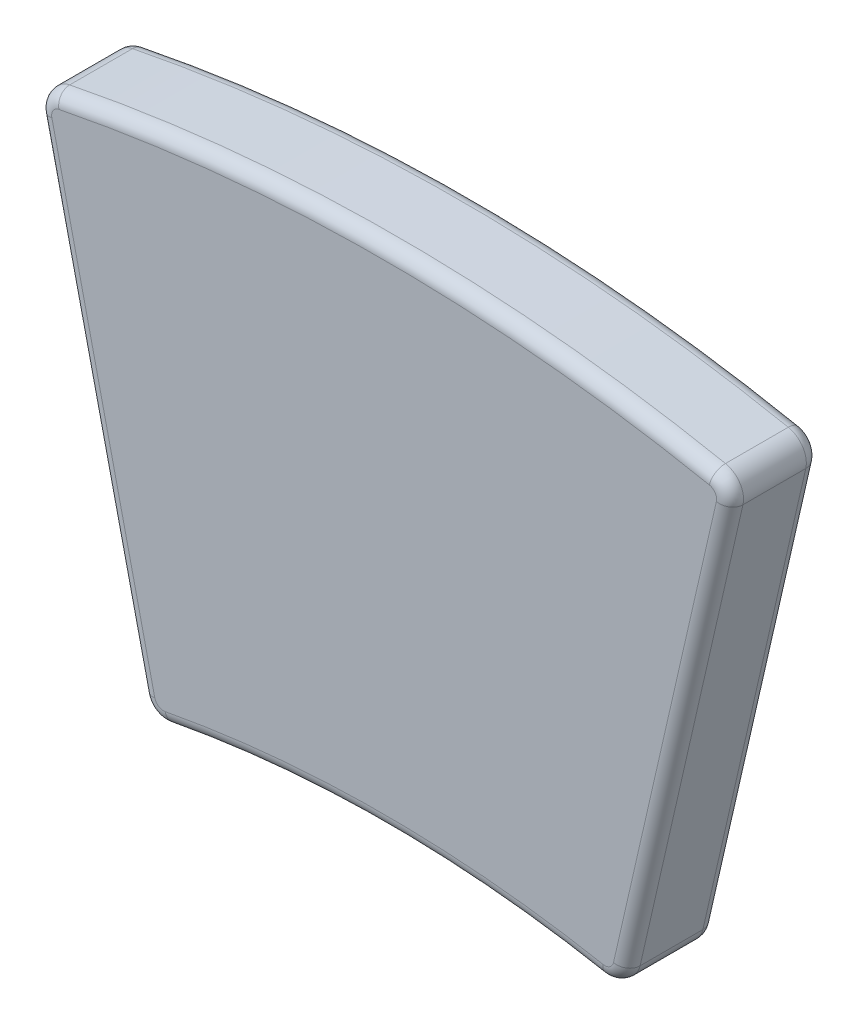
ISO-10303-21;
HEADER;
FILE_DESCRIPTION(('STEP AP214'),'2;1');
FILE_NAME('part.step','',(''),(''),'','','');
FILE_SCHEMA(('AUTOMOTIVE_DESIGN { 1 0 10303 214 1 1 1 1 }'));
ENDSEC;
DATA;
#1=APPLICATION_CONTEXT('core data for automotive mechanical design processes');
#2=APPLICATION_PROTOCOL_DEFINITION('international standard','automotive_design',2000,#1);
#3=PRODUCT_CONTEXT('',#1,'mechanical');
#4=PRODUCT('Part','Part','',(#3));
#5=PRODUCT_RELATED_PRODUCT_CATEGORY('part','',(#4));
#6=PRODUCT_DEFINITION_FORMATION('','',#4);
#7=PRODUCT_DEFINITION_CONTEXT('part definition',#1,'design');
#8=PRODUCT_DEFINITION('design','',#6,#7);
#9=PRODUCT_DEFINITION_SHAPE('','',#8);
#10=(LENGTH_UNIT() NAMED_UNIT(*) SI_UNIT(.MILLI.,.METRE.));
#11=(NAMED_UNIT(*) PLANE_ANGLE_UNIT() SI_UNIT($,.RADIAN.));
#12=(NAMED_UNIT(*) SI_UNIT($,.STERADIAN.) SOLID_ANGLE_UNIT());
#13=UNCERTAINTY_MEASURE_WITH_UNIT(LENGTH_MEASURE(1.E-05),#10,'distance_accuracy_value','');
#14=(GEOMETRIC_REPRESENTATION_CONTEXT(3) GLOBAL_UNCERTAINTY_ASSIGNED_CONTEXT((#13)) GLOBAL_UNIT_ASSIGNED_CONTEXT((#10,
#11,#12)) REPRESENTATION_CONTEXT('',''));
#15=CARTESIAN_POINT('',(0.,0.,0.));
#16=DIRECTION('',(0.,0.,1.));
#17=DIRECTION('',(1.,0.,0.));
#18=AXIS2_PLACEMENT_3D('',#15,#16,#17);
#19=CARTESIAN_POINT('',(0.,0.,-2.8));
#20=DIRECTION('',(0.,0.,1.));
#21=DIRECTION('',(1.,0.,0.));
#22=AXIS2_PLACEMENT_3D('',#19,#20,#21);
#23=PLANE('',#22);
#24=CARTESIAN_POINT('',(0.,0.,-2.8));
#25=DIRECTION('',(0.,0.,1.));
#26=DIRECTION('',(1.,0.,0.));
#27=AXIS2_PLACEMENT_3D('',#24,#25,#26);
#28=CIRCLE('',#27,37.);
#29=CARTESIAN_POINT('',(-7.25000774788659,36.2827422841161,-2.8));
#30=VERTEX_POINT('',#29);
#31=CARTESIAN_POINT('',(7.2500077478863,36.2827422841161,-2.8));
#32=VERTEX_POINT('',#31);
#33=EDGE_CURVE('E179',#30,#32,#28,.F.);
#34=ORIENTED_EDGE('',*,*,#33,.T.);
#35=CARTESIAN_POINT('',(7.21081851681664,36.0866193528507,-2.8));
#36=DIRECTION('',(0.,0.,1.));
#37=DIRECTION('',(1.,0.,0.));
#38=AXIS2_PLACEMENT_3D('',#35,#36,#37);
#39=CIRCLE('',#38,0.2);
#40=CARTESIAN_POINT('',(7.405804099253,36.0421151660594,-2.8));
#41=VERTEX_POINT('',#40);
#42=EDGE_CURVE('E216',#32,#41,#39,.F.);
#43=ORIENTED_EDGE('',*,*,#42,.T.);
#44=DIRECTION('',(0.222520933956307,0.974927912181825,0.));
#45=VECTOR('',#44,1.);
#46=CARTESIAN_POINT('',(-0.779942329745453,0.178016747165044,-2.8));
#47=LINE('',#46,#45);
#48=CARTESIAN_POINT('',(5.11266241618076,25.9952050005029,-2.8));
#49=VERTEX_POINT('',#48);
#50=EDGE_CURVE('E214',#41,#49,#47,.F.);
#51=ORIENTED_EDGE('',*,*,#50,.T.);
#52=CARTESIAN_POINT('',(4.91767683374439,26.0397091872942,-2.8));
#53=DIRECTION('',(0.,0.,1.));
#54=DIRECTION('',(1.,0.,0.));
#55=AXIS2_PLACEMENT_3D('',#52,#53,#54);
#56=CIRCLE('',#55,0.2);
#57=CARTESIAN_POINT('',(4.88056229160293,25.8431830802203,-2.8));
#58=VERTEX_POINT('',#57);
#59=EDGE_CURVE('E212',#49,#58,#56,.F.);
#60=ORIENTED_EDGE('',*,*,#59,.T.);
#61=CARTESIAN_POINT('',(0.,0.,-2.8));
#62=DIRECTION('',(0.,0.,1.));
#63=DIRECTION('',(1.,0.,0.));
#64=AXIS2_PLACEMENT_3D('',#61,#62,#63);
#65=CIRCLE('',#64,26.3);
#66=CARTESIAN_POINT('',(-4.88056229160314,25.8431830802202,-2.8));
#67=VERTEX_POINT('',#66);
#68=EDGE_CURVE('E210',#58,#67,#65,.T.);
#69=ORIENTED_EDGE('',*,*,#68,.T.);
#70=CARTESIAN_POINT('',(-4.91767683374461,26.0397091872942,-2.8));
#71=DIRECTION('',(0.,0.,1.));
#72=DIRECTION('',(1.,0.,0.));
#73=AXIS2_PLACEMENT_3D('',#70,#71,#72);
#74=CIRCLE('',#73,0.2);
#75=CARTESIAN_POINT('',(-5.11266241618097,25.9952050005029,-2.8));
#76=VERTEX_POINT('',#75);
#77=EDGE_CURVE('E208',#67,#76,#74,.F.);
#78=ORIENTED_EDGE('',*,*,#77,.T.);
#79=DIRECTION('',(0.222520933956316,-0.974927912181824,0.));
#80=VECTOR('',#79,1.);
#81=CARTESIAN_POINT('',(0.779942329745459,0.178016747165053,-2.8));
#82=LINE('',#81,#80);
#83=CARTESIAN_POINT('',(-7.4058040992533,36.0421151660593,-2.8));
#84=VERTEX_POINT('',#83);
#85=EDGE_CURVE('E182',#76,#84,#82,.F.);
#86=ORIENTED_EDGE('',*,*,#85,.T.);
#87=CARTESIAN_POINT('',(-7.21081851681694,36.0866193528506,-2.8));
#88=DIRECTION('',(0.,0.,1.));
#89=DIRECTION('',(1.,0.,0.));
#90=AXIS2_PLACEMENT_3D('',#87,#88,#89);
#91=CIRCLE('',#90,0.2);
#92=EDGE_CURVE('E175',#84,#30,#91,.F.);
#93=ORIENTED_EDGE('',*,*,#92,.T.);
#94=EDGE_LOOP('',(#34,#43,#51,#60,#69,#78,#86,#93));
#95=FACE_BOUND('',#94,.T.);
#96=ADVANCED_FACE('F62',(#95),#23,.F.);
#97=CARTESIAN_POINT('',(0.,0.,-0.8));
#98=DIRECTION('',(0.,0.,-1.));
#99=DIRECTION('',(-1.,0.,0.));
#100=AXIS2_PLACEMENT_3D('',#97,#98,#99);
#101=PLANE('',#100);
#102=DIRECTION('',(0.222520933956307,0.974927912181825,0.));
#103=VECTOR('',#102,1.);
#104=CARTESIAN_POINT('',(-0.779942329745452,0.178016747165044,-0.8));
#105=LINE('',#104,#103);
#106=CARTESIAN_POINT('',(5.11266241618076,25.9952050005029,-0.8));
#107=VERTEX_POINT('',#106);
#108=CARTESIAN_POINT('',(7.405804099253,36.0421151660594,-0.8));
#109=VERTEX_POINT('',#108);
#110=EDGE_CURVE('E79',#107,#109,#105,.T.);
#111=ORIENTED_EDGE('',*,*,#110,.T.);
#112=CARTESIAN_POINT('',(7.21081851681664,36.0866193528507,-0.8));
#113=DIRECTION('',(0.,0.,-1.));
#114=DIRECTION('',(-1.,0.,0.));
#115=AXIS2_PLACEMENT_3D('',#112,#113,#114);
#116=CIRCLE('',#115,0.2);
#117=CARTESIAN_POINT('',(7.2500077478863,36.2827422841161,-0.8));
#118=VERTEX_POINT('',#117);
#119=EDGE_CURVE('E259',#109,#118,#116,.F.);
#120=ORIENTED_EDGE('',*,*,#119,.T.);
#121=CARTESIAN_POINT('',(0.,0.,-0.8));
#122=DIRECTION('',(0.,0.,-1.));
#123=DIRECTION('',(-1.,0.,0.));
#124=AXIS2_PLACEMENT_3D('',#121,#122,#123);
#125=CIRCLE('',#124,37.);
#126=CARTESIAN_POINT('',(-7.25000774788659,36.2827422841161,-0.8));
#127=VERTEX_POINT('',#126);
#128=EDGE_CURVE('E247',#118,#127,#125,.F.);
#129=ORIENTED_EDGE('',*,*,#128,.T.);
#130=CARTESIAN_POINT('',(-7.21081851681694,36.0866193528506,-0.8));
#131=DIRECTION('',(0.,0.,-1.));
#132=DIRECTION('',(-1.,0.,0.));
#133=AXIS2_PLACEMENT_3D('',#130,#131,#132);
#134=CIRCLE('',#133,0.2);
#135=CARTESIAN_POINT('',(-7.4058040992533,36.0421151660593,-0.8));
#136=VERTEX_POINT('',#135);
#137=EDGE_CURVE('E249',#127,#136,#134,.F.);
#138=ORIENTED_EDGE('',*,*,#137,.T.);
#139=DIRECTION('',(0.222520933956316,-0.974927912181824,0.));
#140=VECTOR('',#139,1.);
#141=CARTESIAN_POINT('',(0.779942329745457,0.178016747165052,-0.8));
#142=LINE('',#141,#140);
#143=CARTESIAN_POINT('',(-5.11266241618097,25.9952050005029,-0.8));
#144=VERTEX_POINT('',#143);
#145=EDGE_CURVE('E251',#136,#144,#142,.T.);
#146=ORIENTED_EDGE('',*,*,#145,.T.);
#147=CARTESIAN_POINT('',(-4.91767683374461,26.0397091872942,-0.8));
#148=DIRECTION('',(0.,0.,-1.));
#149=DIRECTION('',(-1.,0.,0.));
#150=AXIS2_PLACEMENT_3D('',#147,#148,#149);
#151=CIRCLE('',#150,0.2);
#152=CARTESIAN_POINT('',(-4.88056229160314,25.8431830802202,-0.8));
#153=VERTEX_POINT('',#152);
#154=EDGE_CURVE('E253',#144,#153,#151,.F.);
#155=ORIENTED_EDGE('',*,*,#154,.T.);
#156=CARTESIAN_POINT('',(0.,0.,-0.8));
#157=DIRECTION('',(0.,0.,-1.));
#158=DIRECTION('',(-1.,0.,0.));
#159=AXIS2_PLACEMENT_3D('',#156,#157,#158);
#160=CIRCLE('',#159,26.3);
#161=CARTESIAN_POINT('',(4.88056229160293,25.8431830802203,-0.8));
#162=VERTEX_POINT('',#161);
#163=EDGE_CURVE('E255',#153,#162,#160,.T.);
#164=ORIENTED_EDGE('',*,*,#163,.T.);
#165=CARTESIAN_POINT('',(4.91767683374439,26.0397091872942,-0.8));
#166=DIRECTION('',(0.,0.,-1.));
#167=DIRECTION('',(-1.,0.,0.));
#168=AXIS2_PLACEMENT_3D('',#165,#166,#167);
#169=CIRCLE('',#168,0.2);
#170=EDGE_CURVE('E84',#162,#107,#169,.F.);
#171=ORIENTED_EDGE('',*,*,#170,.T.);
#172=EDGE_LOOP('',(#111,#120,#129,#138,#146,#155,#164,#171));
#173=FACE_BOUND('',#172,.T.);
#174=ADVANCED_FACE('F379',(#173),#101,.F.);
#175=CARTESIAN_POINT('',(-7.81182113339181,36.4728042598851,-0.8));
#176=DIRECTION('',(0.974927912181823,0.222520933956316,0.));
#177=DIRECTION('',(-0.222520933956316,0.974927912181824,0.));
#178=AXIS2_PLACEMENT_3D('',#175,#176,#177);
#179=PLANE('',#178);
#180=DIRECTION('',(0.,0.,-1.));
#181=VECTOR('',#180,1.);
#182=CARTESIAN_POINT('',(-7.69828247290785,35.9753588858724,-0.8));
#183=LINE('',#182,#181);
#184=CARTESIAN_POINT('',(-7.69828247290785,35.9753588858724,-1.1));
#185=VERTEX_POINT('',#184);
#186=CARTESIAN_POINT('',(-7.69828247290785,35.9753588858724,-2.5));
#187=VERTEX_POINT('',#186);
#188=EDGE_CURVE('E322',#185,#187,#183,.T.);
#189=ORIENTED_EDGE('',*,*,#188,.T.);
#190=DIRECTION('',(0.222520933956316,-0.974927912181824,0.));
#191=VECTOR('',#190,1.);
#192=CARTESIAN_POINT('',(-7.81182113339181,36.4728042598851,-2.5));
#193=LINE('',#192,#191);
#194=CARTESIAN_POINT('',(-5.40514078983552,25.928448720316,-2.5));
#195=VERTEX_POINT('',#194);
#196=EDGE_CURVE('E242',#187,#195,#193,.T.);
#197=ORIENTED_EDGE('',*,*,#196,.T.);
#198=DIRECTION('',(0.,0.,-1.));
#199=VECTOR('',#198,1.);
#200=CARTESIAN_POINT('',(-5.40514078983552,25.928448720316,-0.8));
#201=LINE('',#200,#199);
#202=CARTESIAN_POINT('',(-5.40514078983552,25.928448720316,-1.1));
#203=VERTEX_POINT('',#202);
#204=EDGE_CURVE('E277',#195,#203,#201,.F.);
#205=ORIENTED_EDGE('',*,*,#204,.T.);
#206=DIRECTION('',(0.222520933956316,-0.974927912181824,0.));
#207=VECTOR('',#206,1.);
#208=CARTESIAN_POINT('',(-7.81182113339181,36.4728042598851,-1.1));
#209=LINE('',#208,#207);
#210=EDGE_CURVE('E240',#203,#185,#209,.F.);
#211=ORIENTED_EDGE('',*,*,#210,.T.);
#212=EDGE_LOOP('',(#189,#197,#205,#211));
#213=FACE_BOUND('',#212,.T.);
#214=ADVANCED_FACE('F319',(#213),#179,.F.);
#215=CARTESIAN_POINT('',(0.,0.,-0.8));
#216=DIRECTION('',(0.,0.,-1.));
#217=DIRECTION('',(-1.,0.,0.));
#218=AXIS2_PLACEMENT_3D('',#215,#216,#217);
#219=CYLINDRICAL_SURFACE('',#218,37.3);
#220=DIRECTION('',(0.,0.,-1.));
#221=VECTOR('',#220,1.);
#222=CARTESIAN_POINT('',(7.30879159449078,36.5769266810144,-0.8));
#223=LINE('',#222,#221);
#224=CARTESIAN_POINT('',(7.30879159449078,36.5769266810144,-1.1));
#225=VERTEX_POINT('',#224);
#226=CARTESIAN_POINT('',(7.30879159449078,36.5769266810144,-2.5));
#227=VERTEX_POINT('',#226);
#228=EDGE_CURVE('E324',#225,#227,#223,.T.);
#229=ORIENTED_EDGE('',*,*,#228,.T.);
#230=CARTESIAN_POINT('',(0.,0.,-2.5));
#231=DIRECTION('',(0.,0.,1.));
#232=DIRECTION('',(1.,0.,0.));
#233=AXIS2_PLACEMENT_3D('',#230,#231,#232);
#234=CIRCLE('',#233,37.3);
#235=CARTESIAN_POINT('',(-7.30879159449108,36.5769266810143,-2.5));
#236=VERTEX_POINT('',#235);
#237=EDGE_CURVE('E12',#227,#236,#234,.T.);
#238=ORIENTED_EDGE('',*,*,#237,.T.);
#239=DIRECTION('',(0.,0.,-1.));
#240=VECTOR('',#239,1.);
#241=CARTESIAN_POINT('',(-7.30879159449108,36.5769266810143,-0.8));
#242=LINE('',#241,#240);
#243=CARTESIAN_POINT('',(-7.30879159449108,36.5769266810143,-1.1));
#244=VERTEX_POINT('',#243);
#245=EDGE_CURVE('E329',#236,#244,#242,.F.);
#246=ORIENTED_EDGE('',*,*,#245,.T.);
#247=CARTESIAN_POINT('',(0.,0.,-1.1));
#248=DIRECTION('',(0.,0.,-1.));
#249=DIRECTION('',(-1.,0.,0.));
#250=AXIS2_PLACEMENT_3D('',#247,#248,#249);
#251=CIRCLE('',#250,37.3);
#252=EDGE_CURVE('E71',#244,#225,#251,.T.);
#253=ORIENTED_EDGE('',*,*,#252,.T.);
#254=EDGE_LOOP('',(#229,#238,#246,#253));
#255=FACE_BOUND('',#254,.T.);
#256=ADVANCED_FACE('F565',(#255),#219,.T.);
#257=CARTESIAN_POINT('',(7.81182113339151,36.4728042598852,-0.8));
#258=DIRECTION('',(-0.974927912181825,0.222520933956307,0.));
#259=DIRECTION('',(-0.222520933956307,-0.974927912181825,0.));
#260=AXIS2_PLACEMENT_3D('',#257,#258,#259);
#261=PLANE('',#260);
#262=DIRECTION('',(0.,0.,-1.));
#263=VECTOR('',#262,1.);
#264=CARTESIAN_POINT('',(5.40514078983531,25.928448720316,-0.8));
#265=LINE('',#264,#263);
#266=CARTESIAN_POINT('',(5.40514078983531,25.928448720316,-1.1));
#267=VERTEX_POINT('',#266);
#268=CARTESIAN_POINT('',(5.40514078983531,25.928448720316,-2.5));
#269=VERTEX_POINT('',#268);
#270=EDGE_CURVE('E200',#267,#269,#265,.T.);
#271=ORIENTED_EDGE('',*,*,#270,.T.);
#272=DIRECTION('',(0.222520933956307,0.974927912181825,0.));
#273=VECTOR('',#272,1.);
#274=CARTESIAN_POINT('',(7.81182113339151,36.4728042598852,-2.5));
#275=LINE('',#274,#273);
#276=CARTESIAN_POINT('',(7.69828247290755,35.9753588858725,-2.5));
#277=VERTEX_POINT('',#276);
#278=EDGE_CURVE('E226',#269,#277,#275,.T.);
#279=ORIENTED_EDGE('',*,*,#278,.T.);
#280=DIRECTION('',(0.,0.,-1.));
#281=VECTOR('',#280,1.);
#282=CARTESIAN_POINT('',(7.69828247290755,35.9753588858725,-0.8));
#283=LINE('',#282,#281);
#284=CARTESIAN_POINT('',(7.69828247290755,35.9753588858725,-1.1));
#285=VERTEX_POINT('',#284);
#286=EDGE_CURVE('E203',#277,#285,#283,.F.);
#287=ORIENTED_EDGE('',*,*,#286,.T.);
#288=DIRECTION('',(0.222520933956307,0.974927912181825,0.));
#289=VECTOR('',#288,1.);
#290=CARTESIAN_POINT('',(7.81182113339151,36.4728042598852,-1.1));
#291=LINE('',#290,#289);
#292=EDGE_CURVE('E224',#285,#267,#291,.F.);
#293=ORIENTED_EDGE('',*,*,#292,.T.);
#294=EDGE_LOOP('',(#271,#279,#287,#293));
#295=FACE_BOUND('',#294,.T.);
#296=ADVANCED_FACE('F338',(#295),#261,.F.);
#297=CARTESIAN_POINT('',(0.,0.,-0.8));
#298=DIRECTION('',(0.,0.,-1.));
#299=DIRECTION('',(-1.,0.,0.));
#300=AXIS2_PLACEMENT_3D('',#297,#298,#299);
#301=CYLINDRICAL_SURFACE('',#300,26.);
#302=DIRECTION('',(0.,0.,-1.));
#303=VECTOR('',#302,1.);
#304=CARTESIAN_POINT('',(-4.82489047839093,25.5483939196094,-0.8));
#305=LINE('',#304,#303);
#306=CARTESIAN_POINT('',(-4.82489047839093,25.5483939196094,-1.1));
#307=VERTEX_POINT('',#306);
#308=CARTESIAN_POINT('',(-4.82489047839093,25.5483939196094,-2.5));
#309=VERTEX_POINT('',#308);
#310=EDGE_CURVE('E316',#307,#309,#305,.T.);
#311=ORIENTED_EDGE('',*,*,#310,.T.);
#312=CARTESIAN_POINT('',(0.,0.,-2.5));
#313=DIRECTION('',(0.,0.,1.));
#314=DIRECTION('',(1.,0.,0.));
#315=AXIS2_PLACEMENT_3D('',#312,#313,#314);
#316=CIRCLE('',#315,26.);
#317=CARTESIAN_POINT('',(4.82489047839073,25.5483939196094,-2.5));
#318=VERTEX_POINT('',#317);
#319=EDGE_CURVE('E234',#309,#318,#316,.F.);
#320=ORIENTED_EDGE('',*,*,#319,.T.);
#321=DIRECTION('',(0.,0.,-1.));
#322=VECTOR('',#321,1.);
#323=CARTESIAN_POINT('',(4.82489047839073,25.5483939196094,-0.8));
#324=LINE('',#323,#322);
#325=CARTESIAN_POINT('',(4.82489047839073,25.5483939196094,-1.1));
#326=VERTEX_POINT('',#325);
#327=EDGE_CURVE('E332',#318,#326,#324,.F.);
#328=ORIENTED_EDGE('',*,*,#327,.T.);
#329=CARTESIAN_POINT('',(0.,0.,-1.1));
#330=DIRECTION('',(0.,0.,-1.));
#331=DIRECTION('',(-1.,0.,0.));
#332=AXIS2_PLACEMENT_3D('',#329,#330,#331);
#333=CIRCLE('',#332,26.);
#334=EDGE_CURVE('E232',#326,#307,#333,.F.);
#335=ORIENTED_EDGE('',*,*,#334,.T.);
#336=EDGE_LOOP('',(#311,#320,#328,#335));
#337=FACE_BOUND('',#336,.T.);
#338=ADVANCED_FACE('F390',(#337),#301,.F.);
#339=CARTESIAN_POINT('',(-7.21081851681694,36.0866193528506,-0.8));
#340=DIRECTION('',(0.,0.,-1.));
#341=DIRECTION('',(-1.,0.,0.));
#342=AXIS2_PLACEMENT_3D('',#339,#340,#341);
#343=CYLINDRICAL_SURFACE('',#342,0.5);
#344=ORIENTED_EDGE('',*,*,#245,.F.);
#345=CARTESIAN_POINT('',(-7.21081851681694,36.0866193528506,-2.5));
#346=DIRECTION('',(0.,0.,1.));
#347=DIRECTION('',(1.,0.,0.));
#348=AXIS2_PLACEMENT_3D('',#345,#346,#347);
#349=CIRCLE('',#348,0.5);
#350=EDGE_CURVE('E191',#236,#187,#349,.T.);
#351=ORIENTED_EDGE('',*,*,#350,.T.);
#352=ORIENTED_EDGE('',*,*,#188,.F.);
#353=CARTESIAN_POINT('',(-7.21081851681694,36.0866193528506,-1.1));
#354=DIRECTION('',(0.,0.,-1.));
#355=DIRECTION('',(-1.,0.,0.));
#356=AXIS2_PLACEMENT_3D('',#353,#354,#355);
#357=CIRCLE('',#356,0.5);
#358=EDGE_CURVE('E244',#185,#244,#357,.T.);
#359=ORIENTED_EDGE('',*,*,#358,.T.);
#360=EDGE_LOOP('',(#344,#351,#352,#359));
#361=FACE_BOUND('',#360,.T.);
#362=ADVANCED_FACE('F387',(#361),#343,.T.);
#363=CARTESIAN_POINT('',(-4.91767683374461,26.0397091872942,-0.8));
#364=DIRECTION('',(0.,0.,-1.));
#365=DIRECTION('',(-1.,0.,0.));
#366=AXIS2_PLACEMENT_3D('',#363,#364,#365);
#367=CYLINDRICAL_SURFACE('',#366,0.5);
#368=ORIENTED_EDGE('',*,*,#204,.F.);
#369=CARTESIAN_POINT('',(-4.91767683374461,26.0397091872942,-2.5));
#370=DIRECTION('',(0.,0.,1.));
#371=DIRECTION('',(1.,0.,0.));
#372=AXIS2_PLACEMENT_3D('',#369,#370,#371);
#373=CIRCLE('',#372,0.5);
#374=EDGE_CURVE('E238',#195,#309,#373,.T.);
#375=ORIENTED_EDGE('',*,*,#374,.T.);
#376=ORIENTED_EDGE('',*,*,#310,.F.);
#377=CARTESIAN_POINT('',(-4.91767683374461,26.0397091872942,-1.1));
#378=DIRECTION('',(0.,0.,-1.));
#379=DIRECTION('',(-1.,0.,0.));
#380=AXIS2_PLACEMENT_3D('',#377,#378,#379);
#381=CIRCLE('',#380,0.5);
#382=EDGE_CURVE('E236',#307,#203,#381,.T.);
#383=ORIENTED_EDGE('',*,*,#382,.T.);
#384=EDGE_LOOP('',(#368,#375,#376,#383));
#385=FACE_BOUND('',#384,.T.);
#386=ADVANCED_FACE('F313',(#385),#367,.T.);
#387=CARTESIAN_POINT('',(4.91767683374439,26.0397091872942,-0.8));
#388=DIRECTION('',(0.,0.,-1.));
#389=DIRECTION('',(-1.,0.,0.));
#390=AXIS2_PLACEMENT_3D('',#387,#388,#389);
#391=CYLINDRICAL_SURFACE('',#390,0.5);
#392=ORIENTED_EDGE('',*,*,#327,.F.);
#393=CARTESIAN_POINT('',(4.91767683374439,26.0397091872942,-2.5));
#394=DIRECTION('',(0.,0.,1.));
#395=DIRECTION('',(1.,0.,0.));
#396=AXIS2_PLACEMENT_3D('',#393,#394,#395);
#397=CIRCLE('',#396,0.5);
#398=EDGE_CURVE('E230',#318,#269,#397,.T.);
#399=ORIENTED_EDGE('',*,*,#398,.T.);
#400=ORIENTED_EDGE('',*,*,#270,.F.);
#401=CARTESIAN_POINT('',(4.91767683374439,26.0397091872942,-1.1));
#402=DIRECTION('',(0.,0.,-1.));
#403=DIRECTION('',(-1.,0.,0.));
#404=AXIS2_PLACEMENT_3D('',#401,#402,#403);
#405=CIRCLE('',#404,0.5);
#406=EDGE_CURVE('E228',#267,#326,#405,.T.);
#407=ORIENTED_EDGE('',*,*,#406,.T.);
#408=EDGE_LOOP('',(#392,#399,#400,#407));
#409=FACE_BOUND('',#408,.T.);
#410=ADVANCED_FACE('F394',(#409),#391,.T.);
#411=CARTESIAN_POINT('',(7.21081851681664,36.0866193528507,-0.8));
#412=DIRECTION('',(0.,0.,-1.));
#413=DIRECTION('',(-1.,0.,0.));
#414=AXIS2_PLACEMENT_3D('',#411,#412,#413);
#415=CYLINDRICAL_SURFACE('',#414,0.5);
#416=ORIENTED_EDGE('',*,*,#286,.F.);
#417=CARTESIAN_POINT('',(7.21081851681664,36.0866193528507,-2.5));
#418=DIRECTION('',(0.,0.,1.));
#419=DIRECTION('',(1.,0.,0.));
#420=AXIS2_PLACEMENT_3D('',#417,#418,#419);
#421=CIRCLE('',#420,0.5);
#422=EDGE_CURVE('E221',#277,#227,#421,.T.);
#423=ORIENTED_EDGE('',*,*,#422,.T.);
#424=ORIENTED_EDGE('',*,*,#228,.F.);
#425=CARTESIAN_POINT('',(7.21081851681664,36.0866193528507,-1.1));
#426=DIRECTION('',(0.,0.,-1.));
#427=DIRECTION('',(-1.,0.,0.));
#428=AXIS2_PLACEMENT_3D('',#425,#426,#427);
#429=CIRCLE('',#428,0.5);
#430=EDGE_CURVE('E218',#225,#285,#429,.T.);
#431=ORIENTED_EDGE('',*,*,#430,.T.);
#432=EDGE_LOOP('',(#416,#423,#424,#431));
#433=FACE_BOUND('',#432,.T.);
#434=ADVANCED_FACE('F344',(#433),#415,.T.);
#435=CARTESIAN_POINT('',(-4.91767683374461,26.0397091872942,-2.5));
#436=DIRECTION('',(0.,0.,1.));
#437=DIRECTION('',(1.,0.,0.));
#438=AXIS2_PLACEMENT_3D('',#435,#436,#437);
#439=DEGENERATE_TOROIDAL_SURFACE('',#438,0.2,0.3,.T.);
#440=CARTESIAN_POINT('',(-4.88056229160314,25.8431830802202,-2.5));
#441=DIRECTION('',(0.98263053536959,0.185572710707346,0.));
#442=DIRECTION('',(-0.185572710707346,0.98263053536959,0.));
#443=AXIS2_PLACEMENT_3D('',#440,#441,#442);
#444=CIRCLE('',#443,0.3);
#445=EDGE_CURVE('E271',#309,#67,#444,.T.);
#446=ORIENTED_EDGE('',*,*,#445,.F.);
#447=ORIENTED_EDGE('',*,*,#374,.F.);
#448=CARTESIAN_POINT('',(-5.11266241618097,25.9952050005029,-2.5));
#449=DIRECTION('',(-0.222520933956319,0.974927912181823,0.));
#450=DIRECTION('',(-0.974927912181823,-0.222520933956319,0.));
#451=AXIS2_PLACEMENT_3D('',#448,#449,#450);
#452=CIRCLE('',#451,0.3);
#453=EDGE_CURVE('E274',#76,#195,#452,.T.);
#454=ORIENTED_EDGE('',*,*,#453,.F.);
#455=ORIENTED_EDGE('',*,*,#77,.F.);
#456=EDGE_LOOP('',(#446,#447,#454,#455));
#457=FACE_BOUND('',#456,.T.);
#458=ADVANCED_FACE('F367',(#457),#439,.T.);
#459=CARTESIAN_POINT('',(-7.51934275973726,36.539560540072,-2.5));
#460=DIRECTION('',(0.222520933956316,-0.974927912181824,0.));
#461=DIRECTION('',(0.974927912181823,0.222520933956316,0.));
#462=AXIS2_PLACEMENT_3D('',#459,#460,#461);
#463=CYLINDRICAL_SURFACE('',#462,0.3);
#464=ORIENTED_EDGE('',*,*,#453,.T.);
#465=ORIENTED_EDGE('',*,*,#196,.F.);
#466=CARTESIAN_POINT('',(-7.4058040992533,36.0421151660593,-2.5));
#467=DIRECTION('',(-0.222520933956318,0.974927912181823,0.));
#468=DIRECTION('',(-0.974927912181823,-0.222520933956318,0.));
#469=AXIS2_PLACEMENT_3D('',#466,#467,#468);
#470=CIRCLE('',#469,0.3);
#471=EDGE_CURVE('E269',#84,#187,#470,.T.);
#472=ORIENTED_EDGE('',*,*,#471,.F.);
#473=ORIENTED_EDGE('',*,*,#85,.F.);
#474=EDGE_LOOP('',(#464,#465,#472,#473));
#475=FACE_BOUND('',#474,.T.);
#476=ADVANCED_FACE('F369',(#475),#463,.T.);
#477=CARTESIAN_POINT('',(0.,0.,-2.5));
#478=DIRECTION('',(0.,0.,1.));
#479=DIRECTION('',(1.,0.,0.));
#480=AXIS2_PLACEMENT_3D('',#477,#478,#479);
#481=TOROIDAL_SURFACE('',#480,26.3,0.3);
#482=ORIENTED_EDGE('',*,*,#445,.T.);
#483=ORIENTED_EDGE('',*,*,#68,.F.);
#484=CARTESIAN_POINT('',(4.88056229160293,25.8431830802203,-2.5));
#485=DIRECTION('',(0.982630535369592,-0.185572710707336,0.));
#486=DIRECTION('',(0.185572710707336,0.982630535369592,0.));
#487=AXIS2_PLACEMENT_3D('',#484,#485,#486);
#488=CIRCLE('',#487,0.3);
#489=EDGE_CURVE('E194',#318,#58,#488,.T.);
#490=ORIENTED_EDGE('',*,*,#489,.F.);
#491=ORIENTED_EDGE('',*,*,#319,.F.);
#492=EDGE_LOOP('',(#482,#483,#490,#491));
#493=FACE_BOUND('',#492,.T.);
#494=ADVANCED_FACE('F362',(#493),#481,.T.);
#495=CARTESIAN_POINT('',(-7.21081851681694,36.0866193528506,-2.5));
#496=DIRECTION('',(0.,0.,1.));
#497=DIRECTION('',(1.,0.,0.));
#498=AXIS2_PLACEMENT_3D('',#495,#496,#497);
#499=DEGENERATE_TOROIDAL_SURFACE('',#498,0.2,0.3,.T.);
#500=ORIENTED_EDGE('',*,*,#471,.T.);
#501=ORIENTED_EDGE('',*,*,#350,.F.);
#502=CARTESIAN_POINT('',(-7.25000774788659,36.2827422841161,-2.5));
#503=DIRECTION('',(0.98061465632746,0.19594615534829,0.));
#504=DIRECTION('',(-0.19594615534829,0.980614656327461,0.));
#505=AXIS2_PLACEMENT_3D('',#502,#503,#504);
#506=CIRCLE('',#505,0.3);
#507=EDGE_CURVE('E189',#30,#236,#506,.T.);
#508=ORIENTED_EDGE('',*,*,#507,.F.);
#509=ORIENTED_EDGE('',*,*,#92,.F.);
#510=EDGE_LOOP('',(#500,#501,#508,#509));
#511=FACE_BOUND('',#510,.T.);
#512=ADVANCED_FACE('F190',(#511),#499,.T.);
#513=CARTESIAN_POINT('',(4.91767683374439,26.0397091872942,-2.5));
#514=DIRECTION('',(0.,0.,1.));
#515=DIRECTION('',(1.,0.,0.));
#516=AXIS2_PLACEMENT_3D('',#513,#514,#515);
#517=DEGENERATE_TOROIDAL_SURFACE('',#516,0.2,0.3,.T.);
#518=ORIENTED_EDGE('',*,*,#489,.T.);
#519=ORIENTED_EDGE('',*,*,#59,.F.);
#520=CARTESIAN_POINT('',(5.11266241618076,25.9952050005029,-2.5));
#521=DIRECTION('',(0.222520933956307,0.974927912181825,0.));
#522=DIRECTION('',(-0.974927912181825,0.222520933956307,0.));
#523=AXIS2_PLACEMENT_3D('',#520,#521,#522);
#524=CIRCLE('',#523,0.3);
#525=EDGE_CURVE('E195',#269,#49,#524,.T.);
#526=ORIENTED_EDGE('',*,*,#525,.F.);
#527=ORIENTED_EDGE('',*,*,#398,.F.);
#528=EDGE_LOOP('',(#518,#519,#526,#527));
#529=FACE_BOUND('',#528,.T.);
#530=ADVANCED_FACE('F357',(#529),#517,.T.);
#531=CARTESIAN_POINT('',(0.,0.,-2.5));
#532=DIRECTION('',(0.,0.,1.));
#533=DIRECTION('',(1.,0.,0.));
#534=AXIS2_PLACEMENT_3D('',#531,#532,#533);
#535=TOROIDAL_SURFACE('',#534,37.,0.3);
#536=ORIENTED_EDGE('',*,*,#507,.T.);
#537=ORIENTED_EDGE('',*,*,#237,.F.);
#538=CARTESIAN_POINT('',(7.2500077478863,36.2827422841161,-2.5));
#539=DIRECTION('',(0.980614656327463,-0.195946155348277,0.));
#540=DIRECTION('',(0.195946155348277,0.980614656327463,0.));
#541=AXIS2_PLACEMENT_3D('',#538,#539,#540);
#542=CIRCLE('',#541,0.3);
#543=EDGE_CURVE('E198',#32,#227,#542,.T.);
#544=ORIENTED_EDGE('',*,*,#543,.F.);
#545=ORIENTED_EDGE('',*,*,#33,.F.);
#546=EDGE_LOOP('',(#536,#537,#544,#545));
#547=FACE_BOUND('',#546,.T.);
#548=ADVANCED_FACE('F197',(#547),#535,.T.);
#549=CARTESIAN_POINT('',(7.51934275973696,36.5395605400721,-2.5));
#550=DIRECTION('',(0.222520933956307,0.974927912181825,0.));
#551=DIRECTION('',(-0.974927912181825,0.222520933956307,0.));
#552=AXIS2_PLACEMENT_3D('',#549,#550,#551);
#553=CYLINDRICAL_SURFACE('',#552,0.3);
#554=ORIENTED_EDGE('',*,*,#525,.T.);
#555=ORIENTED_EDGE('',*,*,#50,.F.);
#556=CARTESIAN_POINT('',(7.405804099253,36.0421151660594,-2.5));
#557=DIRECTION('',(0.222520933956318,0.974927912181823,0.));
#558=DIRECTION('',(-0.974927912181823,0.222520933956318,0.));
#559=AXIS2_PLACEMENT_3D('',#556,#557,#558);
#560=CIRCLE('',#559,0.3);
#561=EDGE_CURVE('E262',#277,#41,#560,.T.);
#562=ORIENTED_EDGE('',*,*,#561,.F.);
#563=ORIENTED_EDGE('',*,*,#278,.F.);
#564=EDGE_LOOP('',(#554,#555,#562,#563));
#565=FACE_BOUND('',#564,.T.);
#566=ADVANCED_FACE('F352',(#565),#553,.T.);
#567=CARTESIAN_POINT('',(7.21081851681664,36.0866193528507,-2.5));
#568=DIRECTION('',(0.,0.,1.));
#569=DIRECTION('',(1.,0.,0.));
#570=AXIS2_PLACEMENT_3D('',#567,#568,#569);
#571=DEGENERATE_TOROIDAL_SURFACE('',#570,0.2,0.3,.T.);
#572=ORIENTED_EDGE('',*,*,#543,.T.);
#573=ORIENTED_EDGE('',*,*,#422,.F.);
#574=ORIENTED_EDGE('',*,*,#561,.T.);
#575=ORIENTED_EDGE('',*,*,#42,.F.);
#576=EDGE_LOOP('',(#572,#573,#574,#575));
#577=FACE_BOUND('',#576,.T.);
#578=ADVANCED_FACE('F349',(#577),#571,.T.);
#579=CARTESIAN_POINT('',(-4.91767683374461,26.0397091872942,-1.1));
#580=DIRECTION('',(0.,0.,-1.));
#581=DIRECTION('',(-1.,0.,0.));
#582=AXIS2_PLACEMENT_3D('',#579,#580,#581);
#583=DEGENERATE_TOROIDAL_SURFACE('',#582,0.2,0.3,.T.);
#584=CARTESIAN_POINT('',(-5.11266241618097,25.9952050005029,-1.1));
#585=DIRECTION('',(-0.222520933956319,0.974927912181823,0.));
#586=DIRECTION('',(-0.974927912181823,-0.222520933956319,0.));
#587=AXIS2_PLACEMENT_3D('',#584,#585,#586);
#588=CIRCLE('',#587,0.3);
#589=EDGE_CURVE('E293',#203,#144,#588,.T.);
#590=ORIENTED_EDGE('',*,*,#589,.F.);
#591=ORIENTED_EDGE('',*,*,#382,.F.);
#592=CARTESIAN_POINT('',(-4.88056229160314,25.8431830802202,-1.1));
#593=DIRECTION('',(0.98263053536959,0.185572710707346,0.));
#594=DIRECTION('',(-0.185572710707346,0.98263053536959,0.));
#595=AXIS2_PLACEMENT_3D('',#592,#593,#594);
#596=CIRCLE('',#595,0.3);
#597=EDGE_CURVE('E66',#153,#307,#596,.T.);
#598=ORIENTED_EDGE('',*,*,#597,.F.);
#599=ORIENTED_EDGE('',*,*,#154,.F.);
#600=EDGE_LOOP('',(#590,#591,#598,#599));
#601=FACE_BOUND('',#600,.T.);
#602=ADVANCED_FACE('F64',(#601),#583,.T.);
#603=CARTESIAN_POINT('',(0.,0.,-1.1));
#604=DIRECTION('',(0.,0.,-1.));
#605=DIRECTION('',(-1.,0.,0.));
#606=AXIS2_PLACEMENT_3D('',#603,#604,#605);
#607=TOROIDAL_SURFACE('',#606,26.3,0.3);
#608=ORIENTED_EDGE('',*,*,#597,.T.);
#609=ORIENTED_EDGE('',*,*,#334,.F.);
#610=CARTESIAN_POINT('',(4.88056229160293,25.8431830802203,-1.1));
#611=DIRECTION('',(0.982630535369592,-0.185572710707336,0.));
#612=DIRECTION('',(0.185572710707336,0.982630535369592,0.));
#613=AXIS2_PLACEMENT_3D('',#610,#611,#612);
#614=CIRCLE('',#613,0.3);
#615=EDGE_CURVE('E291',#162,#326,#614,.T.);
#616=ORIENTED_EDGE('',*,*,#615,.F.);
#617=ORIENTED_EDGE('',*,*,#163,.F.);
#618=EDGE_LOOP('',(#608,#609,#616,#617));
#619=FACE_BOUND('',#618,.T.);
#620=ADVANCED_FACE('F304',(#619),#607,.T.);
#621=CARTESIAN_POINT('',(0.779942329745457,0.178016747165052,-1.1));
#622=DIRECTION('',(0.222520933956316,-0.974927912181824,0.));
#623=DIRECTION('',(0.974927912181823,0.222520933956316,0.));
#624=AXIS2_PLACEMENT_3D('',#621,#622,#623);
#625=CYLINDRICAL_SURFACE('',#624,0.3);
#626=ORIENTED_EDGE('',*,*,#589,.T.);
#627=ORIENTED_EDGE('',*,*,#145,.F.);
#628=CARTESIAN_POINT('',(-7.4058040992533,36.0421151660593,-1.1));
#629=DIRECTION('',(-0.222520933956319,0.974927912181823,0.));
#630=DIRECTION('',(-0.974927912181823,-0.222520933956319,0.));
#631=AXIS2_PLACEMENT_3D('',#628,#629,#630);
#632=CIRCLE('',#631,0.3);
#633=EDGE_CURVE('E288',#185,#136,#632,.T.);
#634=ORIENTED_EDGE('',*,*,#633,.F.);
#635=ORIENTED_EDGE('',*,*,#210,.F.);
#636=EDGE_LOOP('',(#626,#627,#634,#635));
#637=FACE_BOUND('',#636,.T.);
#638=ADVANCED_FACE('F446',(#637),#625,.T.);
#639=CARTESIAN_POINT('',(4.91767683374439,26.0397091872942,-1.1));
#640=DIRECTION('',(0.,0.,-1.));
#641=DIRECTION('',(-1.,0.,0.));
#642=AXIS2_PLACEMENT_3D('',#639,#640,#641);
#643=DEGENERATE_TOROIDAL_SURFACE('',#642,0.2,0.3,.T.);
#644=ORIENTED_EDGE('',*,*,#615,.T.);
#645=ORIENTED_EDGE('',*,*,#406,.F.);
#646=CARTESIAN_POINT('',(5.11266241618076,25.9952050005029,-1.1));
#647=DIRECTION('',(0.222520933956308,0.974927912181825,0.));
#648=DIRECTION('',(-0.974927912181825,0.222520933956308,0.));
#649=AXIS2_PLACEMENT_3D('',#646,#647,#648);
#650=CIRCLE('',#649,0.3);
#651=EDGE_CURVE('E285',#107,#267,#650,.T.);
#652=ORIENTED_EDGE('',*,*,#651,.F.);
#653=ORIENTED_EDGE('',*,*,#170,.F.);
#654=EDGE_LOOP('',(#644,#645,#652,#653));
#655=FACE_BOUND('',#654,.T.);
#656=ADVANCED_FACE('F453',(#655),#643,.T.);
#657=CARTESIAN_POINT('',(-7.21081851681694,36.0866193528506,-1.1));
#658=DIRECTION('',(0.,0.,-1.));
#659=DIRECTION('',(-1.,0.,0.));
#660=AXIS2_PLACEMENT_3D('',#657,#658,#659);
#661=DEGENERATE_TOROIDAL_SURFACE('',#660,0.2,0.3,.T.);
#662=ORIENTED_EDGE('',*,*,#633,.T.);
#663=ORIENTED_EDGE('',*,*,#137,.F.);
#664=CARTESIAN_POINT('',(-7.25000774788659,36.2827422841161,-1.1));
#665=DIRECTION('',(0.980614656327461,0.195946155348289,0.));
#666=DIRECTION('',(-0.195946155348289,0.980614656327461,0.));
#667=AXIS2_PLACEMENT_3D('',#664,#665,#666);
#668=CIRCLE('',#667,0.3);
#669=EDGE_CURVE('E282',#244,#127,#668,.T.);
#670=ORIENTED_EDGE('',*,*,#669,.F.);
#671=ORIENTED_EDGE('',*,*,#358,.F.);
#672=EDGE_LOOP('',(#662,#663,#670,#671));
#673=FACE_BOUND('',#672,.T.);
#674=ADVANCED_FACE('F461',(#673),#661,.T.);
#675=CARTESIAN_POINT('',(-0.779942329745453,0.178016747165044,-1.1));
#676=DIRECTION('',(0.222520933956307,0.974927912181825,0.));
#677=DIRECTION('',(-0.974927912181825,0.222520933956307,0.));
#678=AXIS2_PLACEMENT_3D('',#675,#676,#677);
#679=CYLINDRICAL_SURFACE('',#678,0.3);
#680=ORIENTED_EDGE('',*,*,#651,.T.);
#681=ORIENTED_EDGE('',*,*,#292,.F.);
#682=CARTESIAN_POINT('',(7.405804099253,36.0421151660594,-1.1));
#683=DIRECTION('',(0.222520933956296,0.974927912181828,0.));
#684=DIRECTION('',(-0.974927912181828,0.222520933956296,0.));
#685=AXIS2_PLACEMENT_3D('',#682,#683,#684);
#686=CIRCLE('',#685,0.3);
#687=EDGE_CURVE('E280',#109,#285,#686,.T.);
#688=ORIENTED_EDGE('',*,*,#687,.F.);
#689=ORIENTED_EDGE('',*,*,#110,.F.);
#690=EDGE_LOOP('',(#680,#681,#688,#689));
#691=FACE_BOUND('',#690,.T.);
#692=ADVANCED_FACE('F470',(#691),#679,.T.);
#693=CARTESIAN_POINT('',(0.,0.,-1.1));
#694=DIRECTION('',(0.,0.,-1.));
#695=DIRECTION('',(-1.,0.,0.));
#696=AXIS2_PLACEMENT_3D('',#693,#694,#695);
#697=TOROIDAL_SURFACE('',#696,37.,0.3);
#698=ORIENTED_EDGE('',*,*,#669,.T.);
#699=ORIENTED_EDGE('',*,*,#128,.F.);
#700=CARTESIAN_POINT('',(7.2500077478863,36.2827422841161,-1.1));
#701=DIRECTION('',(0.980614656327463,-0.195946155348277,0.));
#702=DIRECTION('',(0.195946155348278,0.980614656327463,0.));
#703=AXIS2_PLACEMENT_3D('',#700,#701,#702);
#704=CIRCLE('',#703,0.3);
#705=EDGE_CURVE('E278',#225,#118,#704,.T.);
#706=ORIENTED_EDGE('',*,*,#705,.F.);
#707=ORIENTED_EDGE('',*,*,#252,.F.);
#708=EDGE_LOOP('',(#698,#699,#706,#707));
#709=FACE_BOUND('',#708,.T.);
#710=ADVANCED_FACE('F479',(#709),#697,.T.);
#711=CARTESIAN_POINT('',(7.21081851681664,36.0866193528507,-1.1));
#712=DIRECTION('',(0.,0.,-1.));
#713=DIRECTION('',(-1.,0.,0.));
#714=AXIS2_PLACEMENT_3D('',#711,#712,#713);
#715=DEGENERATE_TOROIDAL_SURFACE('',#714,0.2,0.3,.T.);
#716=ORIENTED_EDGE('',*,*,#687,.T.);
#717=ORIENTED_EDGE('',*,*,#430,.F.);
#718=ORIENTED_EDGE('',*,*,#705,.T.);
#719=ORIENTED_EDGE('',*,*,#119,.F.);
#720=EDGE_LOOP('',(#716,#717,#718,#719));
#721=FACE_BOUND('',#720,.T.);
#722=ADVANCED_FACE('F488',(#721),#715,.T.);
#723=CLOSED_SHELL('',(#96,#174,#214,#256,#296,#338,#362,#386,#410,#434,#458,#476,#494,#512,#530,
#548,#566,#578,#602,#620,#638,#656,#674,#692,#710,#722));
#724=MANIFOLD_SOLID_BREP('B2',#723);
#725=ADVANCED_BREP_SHAPE_REPRESENTATION('',(#18,#724),#14);
#726=SHAPE_DEFINITION_REPRESENTATION(#9,#725);
ENDSEC;
END-ISO-10303-21;
